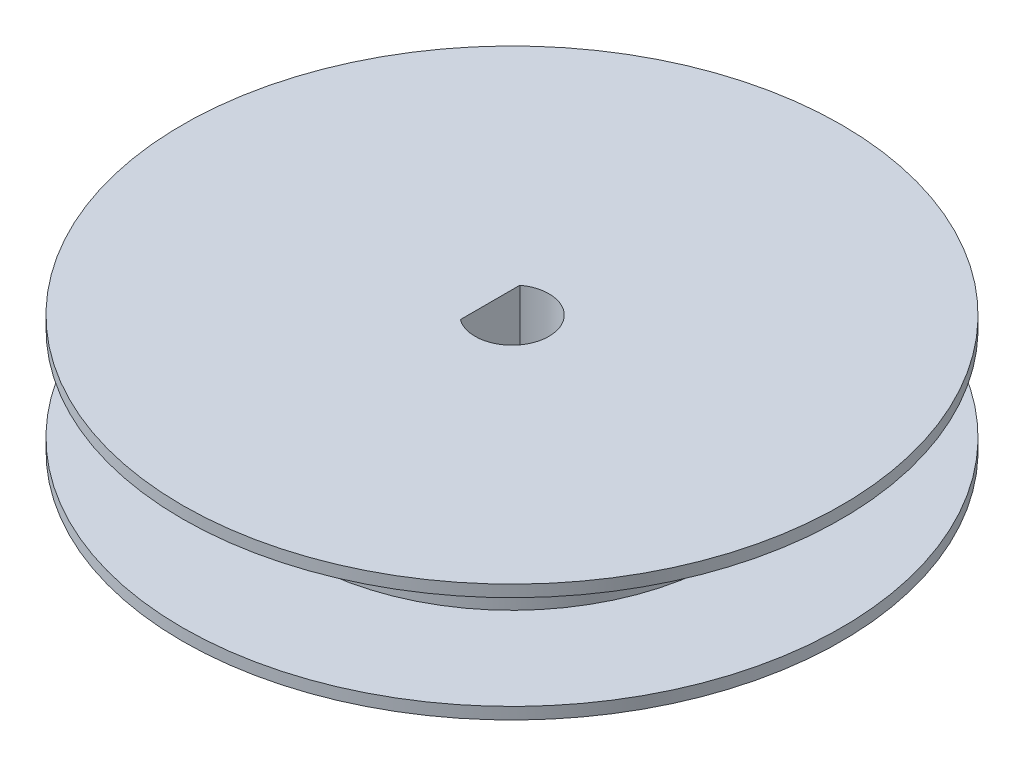
ISO-10303-21;
HEADER;
FILE_DESCRIPTION(('STEP AP214'),'2;1');
FILE_NAME('part.step','',(''),(''),'','','');
FILE_SCHEMA(('AUTOMOTIVE_DESIGN { 1 0 10303 214 1 1 1 1 }'));
ENDSEC;
DATA;
#1=APPLICATION_CONTEXT('core data for automotive mechanical design processes');
#2=APPLICATION_PROTOCOL_DEFINITION('international standard','automotive_design',2000,#1);
#3=PRODUCT_CONTEXT('',#1,'mechanical');
#4=PRODUCT('Part','Part','',(#3));
#5=PRODUCT_RELATED_PRODUCT_CATEGORY('part','',(#4));
#6=PRODUCT_DEFINITION_FORMATION('','',#4);
#7=PRODUCT_DEFINITION_CONTEXT('part definition',#1,'design');
#8=PRODUCT_DEFINITION('design','',#6,#7);
#9=PRODUCT_DEFINITION_SHAPE('','',#8);
#10=(LENGTH_UNIT() NAMED_UNIT(*) SI_UNIT(.MILLI.,.METRE.));
#11=(NAMED_UNIT(*) PLANE_ANGLE_UNIT() SI_UNIT($,.RADIAN.));
#12=(NAMED_UNIT(*) SI_UNIT($,.STERADIAN.) SOLID_ANGLE_UNIT());
#13=UNCERTAINTY_MEASURE_WITH_UNIT(LENGTH_MEASURE(1.E-05),#10,'distance_accuracy_value','');
#14=(GEOMETRIC_REPRESENTATION_CONTEXT(3) GLOBAL_UNCERTAINTY_ASSIGNED_CONTEXT((#13)) GLOBAL_UNIT_ASSIGNED_CONTEXT((#10,
#11,#12)) REPRESENTATION_CONTEXT('',''));
#15=CARTESIAN_POINT('',(0.,0.,0.));
#16=DIRECTION('',(0.,0.,1.));
#17=DIRECTION('',(1.,0.,0.));
#18=AXIS2_PLACEMENT_3D('',#15,#16,#17);
#19=CARTESIAN_POINT('',(0.,5.,0.));
#20=DIRECTION('',(0.,-1.,0.));
#21=DIRECTION('',(0.,0.,-1.));
#22=AXIS2_PLACEMENT_3D('',#19,#20,#21);
#23=CYLINDRICAL_SURFACE('',#22,9.);
#24=CARTESIAN_POINT('',(0.,4.5,0.));
#25=DIRECTION('',(0.,1.,0.));
#26=DIRECTION('',(0.,0.,1.));
#27=AXIS2_PLACEMENT_3D('',#24,#25,#26);
#28=CIRCLE('',#27,9.);
#29=CARTESIAN_POINT('',(0.,4.5,9.));
#30=VERTEX_POINT('',#29);
#31=EDGE_CURVE('E54',#30,#30,#28,.T.);
#32=ORIENTED_EDGE('',*,*,#31,.F.);
#33=EDGE_LOOP('',(#32));
#34=FACE_BOUND('',#33,.T.);
#35=CARTESIAN_POINT('',(-4.49164566759085,2.58104941694813,7.79904604402438));
#36=CARTESIAN_POINT('',(-4.49164424817047,2.59594071861455,7.79904690047306));
#37=CARTESIAN_POINT('',(-4.49047547234197,2.61084088901665,7.7997203430435));
#38=CARTESIAN_POINT('',(-4.48591116716041,2.64018290334793,7.80234628001196));
#39=CARTESIAN_POINT('',(-4.48251278517092,2.65462413524519,7.80430041296681));
#40=CARTESIAN_POINT('',(-4.4728452666167,2.68567736325836,7.80984583738454));
#41=CARTESIAN_POINT('',(-4.46611988446609,2.70209945567145,7.8136965962072));
#42=CARTESIAN_POINT('',(-4.45043475034739,2.73346180411599,7.82264100071128));
#43=CARTESIAN_POINT('',(-4.44147128386537,2.74839953838003,7.8277367123158));
#44=CARTESIAN_POINT('',(-4.41686976620896,2.78399139429734,7.84165460920603));
#45=CARTESIAN_POINT('',(-4.40015996145949,2.80367215010205,7.85105137282074));
#46=CARTESIAN_POINT('',(-4.36429115712529,2.83992071734584,7.8710476162359));
#47=CARTESIAN_POINT('',(-4.34512617018043,2.85648066575305,7.88165002885868));
#48=CARTESIAN_POINT('',(-4.28885487153041,2.899445851571,7.91248501268091));
#49=CARTESIAN_POINT('',(-4.24989304987902,2.92282806760217,7.93350259957651));
#50=CARTESIAN_POINT('',(-4.16921315314521,2.96322604645371,7.97620044182835));
#51=CARTESIAN_POINT('',(-4.12748879977326,2.98022667804934,7.99788214194875));
#52=CARTESIAN_POINT('',(-4.04103675766599,3.00979891165106,8.04191811782925));
#53=CARTESIAN_POINT('',(-3.99625575979133,3.02221253530191,8.06427186333371));
#54=CARTESIAN_POINT('',(-3.90554235538411,3.04292364958125,8.10859388646453));
#55=CARTESIAN_POINT('',(-3.85960880263176,3.05121685700186,8.13056174017322));
#56=CARTESIAN_POINT('',(-3.76684010735089,3.06443256883602,8.17395533478064));
#57=CARTESIAN_POINT('',(-3.72000258355854,3.06934438983559,8.19537915334569));
#58=CARTESIAN_POINT('',(-3.62578246690605,3.0762793750885,8.23749770966835));
#59=CARTESIAN_POINT('',(-3.57839968825551,3.07830152345385,8.25819218852811));
#60=CARTESIAN_POINT('',(-3.43791031702988,3.08059148112285,8.31811045318641));
#61=CARTESIAN_POINT('',(-3.34425364912683,3.07735197232397,8.35620185932707));
#62=CARTESIAN_POINT('',(-3.15615302001072,3.06317218142298,8.42905098946962));
#63=CARTESIAN_POINT('',(-3.06170818259119,3.05222173757036,8.46380424558062));
#64=CARTESIAN_POINT('',(-2.87295971552423,3.02346301360818,8.52971561174644));
#65=CARTESIAN_POINT('',(-2.77865670228749,3.00567824212634,8.56088557523283));
#66=CARTESIAN_POINT('',(-2.63765864609262,2.97366859595122,8.6049511030786));
#67=CARTESIAN_POINT('',(-2.59075994651196,2.96211744914117,8.61918458788604));
#68=CARTESIAN_POINT('',(-2.49723182833092,2.93702845105655,8.6467454392234));
#69=CARTESIAN_POINT('',(-2.45060235130082,2.92349104910727,8.66007300969166));
#70=CARTESIAN_POINT('',(-2.36791318339599,2.89722539015012,8.6829952673442));
#71=CARTESIAN_POINT('',(-2.33175780888706,2.88496017656611,8.69277193604383));
#72=CARTESIAN_POINT('',(-2.25991911928232,2.85857148515549,8.7117246952622));
#73=CARTESIAN_POINT('',(-2.22423635932607,2.84444600424664,8.72090012220145));
#74=CARTESIAN_POINT('',(-2.15540963657628,2.81438080447078,8.73815782643224));
#75=CARTESIAN_POINT('',(-2.12222501311193,2.79855693494186,8.74627116709942));
#76=CARTESIAN_POINT('',(-2.07377268915832,2.77212160524061,8.75783904930951));
#77=CARTESIAN_POINT('',(-2.05784466252804,2.76286128344243,8.76159420735107));
#78=CARTESIAN_POINT('',(-2.02670559003009,2.74312876500504,8.76884929074329));
#79=CARTESIAN_POINT('',(-2.01149356008554,2.73265830436466,8.77234957025398));
#80=CARTESIAN_POINT('',(-1.98516351504994,2.71223241908973,8.77834102996023));
#81=CARTESIAN_POINT('',(-1.97382793329622,2.70257919140966,8.78089543461412));
#82=CARTESIAN_POINT('',(-1.95254414749962,2.68178303717488,8.78565238515577));
#83=CARTESIAN_POINT('',(-1.94258938423108,2.67064768319939,8.78785660233295));
#84=CARTESIAN_POINT('',(-1.92973194903335,2.65266154788444,8.79068562611621));
#85=CARTESIAN_POINT('',(-1.92584019431708,2.64656317240422,8.79153867775325));
#86=CARTESIAN_POINT('',(-1.91889949189552,2.63387170270301,8.793056192357));
#87=CARTESIAN_POINT('',(-1.9158503718728,2.62727870998159,8.79372069388264));
#88=CARTESIAN_POINT('',(-1.91084680741415,2.61355045840981,8.79480933861912));
#89=CARTESIAN_POINT('',(-1.90890833113658,2.6064088864101,8.79522997667999));
#90=CARTESIAN_POINT('',(-1.90647795415078,2.59187582667675,8.7957571333182));
#91=CARTESIAN_POINT('',(-1.90598301739141,2.58448489658217,8.79586431116614));
#92=CARTESIAN_POINT('',(-1.90647731628155,2.57081496247826,8.79575716764348));
#93=CARTESIAN_POINT('',(-1.90726547794547,2.56452731750248,8.79558640332063));
#94=CARTESIAN_POINT('',(-1.90985977368662,2.55217470667787,8.79502344437804));
#95=CARTESIAN_POINT('',(-1.91166717910044,2.54611002902646,8.79463097321494));
#96=CARTESIAN_POINT('',(-1.91699431332262,2.53200521191695,8.79347159204476));
#97=CARTESIAN_POINT('',(-1.92090758551873,2.52412304528623,8.79261820035698));
#98=CARTESIAN_POINT('',(-1.92986820585446,2.50907192643088,8.7906558350962));
#99=CARTESIAN_POINT('',(-1.93491844572564,2.50190486126029,8.78954620963712));
#100=CARTESIAN_POINT('',(-1.95064835967922,2.48206542561524,8.78607308541351));
#101=CARTESIAN_POINT('',(-1.96231162434127,2.47022693035966,8.78347822318489));
#102=CARTESIAN_POINT('',(-1.98701177615187,2.44820314982875,8.77792390482094));
#103=CARTESIAN_POINT('',(-2.00005327933477,2.43802373031595,8.7749632174702));
#104=CARTESIAN_POINT('',(-2.03694269898319,2.41168403230225,8.76649525380214));
#105=CARTESIAN_POINT('',(-2.06158770532848,2.39673415923424,8.76073733852794));
#106=CARTESIAN_POINT('',(-2.11198600286351,2.36903240084626,8.7487253186128));
#107=CARTESIAN_POINT('',(-2.13774200255244,2.35628631640323,8.74246996586682));
#108=CARTESIAN_POINT('',(-2.19001512851203,2.3322985569165,8.72952242842804));
#109=CARTESIAN_POINT('',(-2.2165356541974,2.32106551534538,8.72282803628236));
#110=CARTESIAN_POINT('',(-2.26992305425342,2.29981834122289,8.70908775788765));
#111=CARTESIAN_POINT('',(-2.29678946786106,2.28980274196194,8.70204230930172));
#112=CARTESIAN_POINT('',(-2.36915207533252,2.26424582761435,8.68270241798373));
#113=CARTESIAN_POINT('',(-2.41487756671412,2.24958543530944,8.67010032761753));
#114=CARTESIAN_POINT('',(-2.50670413573591,2.22239093928594,8.64399894288647));
#115=CARTESIAN_POINT('',(-2.55280532050986,2.20985746602814,8.63049938413885));
#116=CARTESIAN_POINT('',(-2.69156211301152,2.17495078277808,8.58864527206406));
#117=CARTESIAN_POINT('',(-2.78452250158811,2.15532080170616,8.55897479128446));
#118=CARTESIAN_POINT('',(-2.97019577396397,2.12271576982825,8.49632402116192));
#119=CARTESIAN_POINT('',(-3.06290866299562,2.10972327919,8.46335268054201));
#120=CARTESIAN_POINT('',(-3.24783113792676,2.09081508858936,8.39412527925714));
#121=CARTESIAN_POINT('',(-3.34004079080632,2.08489842278853,8.35786966761671));
#122=CARTESIAN_POINT('',(-3.52278058348876,2.0814631680622,8.2824934158325));
#123=CARTESIAN_POINT('',(-3.61331794898789,2.08388635057757,8.24339449872908));
#124=CARTESIAN_POINT('',(-3.74742157015349,2.09558001281684,8.18286244553108));
#125=CARTESIAN_POINT('',(-3.79178443051725,2.10080945439667,8.16239800542036));
#126=CARTESIAN_POINT('',(-3.87976215372909,2.11444370444102,8.12094848759629));
#127=CARTESIAN_POINT('',(-3.92337741995693,2.12284674028725,8.09996370662289));
#128=CARTESIAN_POINT('',(-4.00864335219724,2.14328041180959,8.05810076372553));
#129=CARTESIAN_POINT('',(-4.05031601671984,2.15523183677721,8.03722948634152));
#130=CARTESIAN_POINT('',(-4.13216121100109,2.1837537944748,7.99545794917381));
#131=CARTESIAN_POINT('',(-4.17233231612183,2.20032859360875,7.97455768044767));
#132=CARTESIAN_POINT('',(-4.24166794513081,2.2352396343202,7.93784901747984));
#133=CARTESIAN_POINT('',(-4.27133789825283,2.25242523099705,7.92191451711759));
#134=CARTESIAN_POINT('',(-4.3280539990733,2.29143458732397,7.89106935956906));
#135=CARTESIAN_POINT('',(-4.35510852080779,2.31324277835697,7.8761554826292));
#136=CARTESIAN_POINT('',(-4.39308144175215,2.35111440038579,7.85500276195926));
#137=CARTESIAN_POINT('',(-4.40562736024163,2.36509210316689,7.84796969235094));
#138=CARTESIAN_POINT('',(-4.42893996849578,2.39487978186051,7.83483682042741));
#139=CARTESIAN_POINT('',(-4.43970794406391,2.41068841944316,7.82873634390226));
#140=CARTESIAN_POINT('',(-4.45713070527412,2.44127000479232,7.81882785343145));
#141=CARTESIAN_POINT('',(-4.46417482036432,2.45574873416197,7.8148058141529));
#142=CARTESIAN_POINT('',(-4.47609621061979,2.48583761892642,7.80798375416658));
#143=CARTESIAN_POINT('',(-4.48097822402275,2.50144521215045,7.80518106150554));
#144=CARTESIAN_POINT('',(-4.48688464239684,2.52781324903584,7.80178654396177));
#145=CARTESIAN_POINT('',(-4.48866151619574,2.53835334317456,7.80076404584509));
#146=CARTESIAN_POINT('',(-4.49104255520491,2.55961056157812,7.79939347868631));
#147=CARTESIAN_POINT('',(-4.4916466895725,2.57032769049144,7.79904542738195));
#148=CARTESIAN_POINT('',(-4.49164566759085,2.58104941694813,7.79904604402438));
#149=B_SPLINE_CURVE_WITH_KNOTS('',3,(#35,#36,#37,#38,#39,#40,#41,#42,#43,#44,#45,#46,#47,#48,
#49,#50,#51,#52,#53,#54,#55,#56,#57,#58,#59,#60,#61,#62,#63,#64,#65,#66,#67,#68,#69,#70,#71,#72,
#73,#74,#75,#76,#77,#78,#79,#80,#81,#82,#83,#84,#85,#86,#87,#88,#89,#90,#91,#92,#93,#94,#95,#96,
#97,#98,#99,#100,#101,#102,#103,#104,#105,#106,#107,#108,#109,#110,#111,#112,#113,#114,#115,
#116,#117,#118,#119,#120,#121,#122,#123,#124,#125,#126,#127,#128,#129,#130,#131,#132,#133,#134,
#135,#136,#137,#138,#139,#140,#141,#142,#143,#144,#145,#146,#147,#148),.UNSPECIFIED.,.T.,.F.,(4,
2,2,2,2,2,2,2,2,2,2,2,2,2,2,2,2,2,2,2,2,2,2,2,2,2,2,2,2,2,2,2,2,2,2,2,2,2,2,2,2,2,2,2,2,2,2,2,2,
2,2,2,2,2,2,2,4),(0.,0.0446310538585602,0.0893193219045394,0.143493464926478,0.197758124634753,
0.279717236644881,0.361880165917336,0.511232400298412,0.660936556334716,0.815399769360729,
0.970023214019308,1.12513297311367,1.28029724890503,1.58330263497744,1.88670808168471,
2.18907908767685,2.34010562414268,2.4910980483172,2.60929041082653,2.72761109622234,
2.84039419214765,2.8967711217298,2.95306815707545,2.99831669884603,3.04334234394718,
3.06514481462663,3.08694282343165,3.1090468368636,3.13110432750948,3.15002470597979,
3.16896873683371,3.1953417661522,3.22178264525658,3.27196057435382,3.32231223274262,
3.41026511432012,3.49844609548203,3.58711065912902,3.67566732288123,3.82452115350776,
3.9734190305673,4.27169745372123,4.56918807446831,4.866638083599,5.16201553147986,
5.3093349691288,5.45657224257485,5.60074249624453,5.74504623144284,5.85823118862166,
5.97104083643137,6.03107281102987,6.09106117868609,6.14066809577652,6.19016575493745,
6.2222992364279,6.25443356300757),.UNSPECIFIED.);
#150=CARTESIAN_POINT('',(-4.49164566759085,2.58104941694813,7.79904604402438));
#151=VERTEX_POINT('',#150);
#152=EDGE_CURVE('E89',#151,#151,#149,.T.);
#153=ORIENTED_EDGE('',*,*,#152,.T.);
#154=EDGE_LOOP('',(#153));
#155=FACE_BOUND('',#154,.T.);
#156=CARTESIAN_POINT('',(4.49164566759085,2.58104941694813,7.79904604402438));
#157=CARTESIAN_POINT('',(4.49164424817047,2.56615811528171,7.79904690047306));
#158=CARTESIAN_POINT('',(4.49047547234197,2.5512579448796,7.7997203430435));
#159=CARTESIAN_POINT('',(4.48591116716041,2.52191593054833,7.80234628001196));
#160=CARTESIAN_POINT('',(4.48251278517092,2.50747469865107,7.80430041296681));
#161=CARTESIAN_POINT('',(4.4728452666167,2.4764214706379,7.80984583738454));
#162=CARTESIAN_POINT('',(4.46611988446609,2.45999937822481,7.8136965962072));
#163=CARTESIAN_POINT('',(4.45043475034739,2.42863702978027,7.82264100071128));
#164=CARTESIAN_POINT('',(4.44147128386537,2.41369929551622,7.8277367123158));
#165=CARTESIAN_POINT('',(4.41686976620896,2.37810743959891,7.84165460920603));
#166=CARTESIAN_POINT('',(4.40015996145949,2.3584266837942,7.85105137282074));
#167=CARTESIAN_POINT('',(4.36429115712529,2.32217811655041,7.8710476162359));
#168=CARTESIAN_POINT('',(4.34512617018043,2.3056181681432,7.88165002885868));
#169=CARTESIAN_POINT('',(4.28885487153041,2.26265298232526,7.91248501268091));
#170=CARTESIAN_POINT('',(4.24989304987902,2.23927076629408,7.93350259957651));
#171=CARTESIAN_POINT('',(4.16921315314521,2.19887278744255,7.97620044182835));
#172=CARTESIAN_POINT('',(4.12748879977326,2.18187215584691,7.99788214194875));
#173=CARTESIAN_POINT('',(4.04103675766599,2.1522999222452,8.04191811782925));
#174=CARTESIAN_POINT('',(3.99625575979133,2.13988629859434,8.06427186333371));
#175=CARTESIAN_POINT('',(3.90554235538411,2.119175184315,8.10859388646453));
#176=CARTESIAN_POINT('',(3.85960880263176,2.11088197689439,8.13056174017322));
#177=CARTESIAN_POINT('',(3.76684010735089,2.09766626506023,8.17395533478064));
#178=CARTESIAN_POINT('',(3.72000258355854,2.09275444406066,8.19537915334569));
#179=CARTESIAN_POINT('',(3.62578246690605,2.08581945880776,8.23749770966835));
#180=CARTESIAN_POINT('',(3.57839968825551,2.0837973104424,8.25819218852811));
#181=CARTESIAN_POINT('',(3.43791031702988,2.0815073527734,8.31811045318641));
#182=CARTESIAN_POINT('',(3.34425364912683,2.08474686157228,8.35620185932707));
#183=CARTESIAN_POINT('',(3.15615302001072,2.09892665247327,8.42905098946962));
#184=CARTESIAN_POINT('',(3.06170818259119,2.1098770963259,8.46380424558062));
#185=CARTESIAN_POINT('',(2.87295971552423,2.13863582028807,8.52971561174644));
#186=CARTESIAN_POINT('',(2.77865670228749,2.15642059176992,8.56088557523283));
#187=CARTESIAN_POINT('',(2.63765864609262,2.18843023794503,8.6049511030786));
#188=CARTESIAN_POINT('',(2.59075994651196,2.19998138475508,8.61918458788604));
#189=CARTESIAN_POINT('',(2.49723182833092,2.2250703828397,8.6467454392234));
#190=CARTESIAN_POINT('',(2.45060235130082,2.23860778478899,8.66007300969166));
#191=CARTESIAN_POINT('',(2.36791318339599,2.26487344374614,8.6829952673442));
#192=CARTESIAN_POINT('',(2.33175780888706,2.27713865733014,8.69277193604383));
#193=CARTESIAN_POINT('',(2.25991911928232,2.30352734874077,8.7117246952622));
#194=CARTESIAN_POINT('',(2.22423635932607,2.31765282964962,8.72090012220145));
#195=CARTESIAN_POINT('',(2.15540963657628,2.34771802942547,8.73815782643224));
#196=CARTESIAN_POINT('',(2.12222501311193,2.36354189895439,8.74627116709942));
#197=CARTESIAN_POINT('',(2.07377268915832,2.38997722865564,8.75783904930951));
#198=CARTESIAN_POINT('',(2.05784466252804,2.39923755045383,8.76159420735107));
#199=CARTESIAN_POINT('',(2.02670559003009,2.41897006889122,8.76884929074329));
#200=CARTESIAN_POINT('',(2.01149356008554,2.42944052953159,8.77234957025398));
#201=CARTESIAN_POINT('',(1.98516351504994,2.44986641480653,8.77834102996023));
#202=CARTESIAN_POINT('',(1.97382793329622,2.45951964248659,8.78089543461412));
#203=CARTESIAN_POINT('',(1.95254414749962,2.48031579672137,8.78565238515577));
#204=CARTESIAN_POINT('',(1.94258938423108,2.49145115069686,8.78785660233295));
#205=CARTESIAN_POINT('',(1.92973194903335,2.50943728601181,8.79068562611621));
#206=CARTESIAN_POINT('',(1.92584019431708,2.51553566149203,8.79153867775325));
#207=CARTESIAN_POINT('',(1.91889949189552,2.52822713119324,8.793056192357));
#208=CARTESIAN_POINT('',(1.9158503718728,2.53482012391467,8.79372069388264));
#209=CARTESIAN_POINT('',(1.91084680741415,2.54854837548644,8.79480933861912));
#210=CARTESIAN_POINT('',(1.90890833113658,2.55568994748616,8.79522997667999));
#211=CARTESIAN_POINT('',(1.90647795415078,2.5702230072195,8.7957571333182));
#212=CARTESIAN_POINT('',(1.90598301739141,2.57761393731408,8.79586431116614));
#213=CARTESIAN_POINT('',(1.90647731628155,2.591283871418,8.79575716764348));
#214=CARTESIAN_POINT('',(1.90726547794547,2.59757151639377,8.79558640332063));
#215=CARTESIAN_POINT('',(1.90985977368662,2.60992412721839,8.79502344437804));
#216=CARTESIAN_POINT('',(1.91166717910044,2.61598880486979,8.79463097321494));
#217=CARTESIAN_POINT('',(1.91699431332262,2.6300936219793,8.79347159204476));
#218=CARTESIAN_POINT('',(1.92090758551873,2.63797578861003,8.79261820035698));
#219=CARTESIAN_POINT('',(1.92986820585446,2.65302690746537,8.7906558350962));
#220=CARTESIAN_POINT('',(1.93491844572564,2.66019397263597,8.78954620963712));
#221=CARTESIAN_POINT('',(1.95064835967922,2.68003340828102,8.78607308541351));
#222=CARTESIAN_POINT('',(1.96231162434127,2.69187190353659,8.78347822318489));
#223=CARTESIAN_POINT('',(1.98701177615187,2.7138956840675,8.77792390482094));
#224=CARTESIAN_POINT('',(2.00005327933477,2.7240751035803,8.7749632174702));
#225=CARTESIAN_POINT('',(2.03694269898319,2.750414801594,8.76649525380214));
#226=CARTESIAN_POINT('',(2.06158770532848,2.76536467466202,8.76073733852794));
#227=CARTESIAN_POINT('',(2.11198600286351,2.79306643304999,8.7487253186128));
#228=CARTESIAN_POINT('',(2.13774200255244,2.80581251749303,8.74246996586682));
#229=CARTESIAN_POINT('',(2.19001512851203,2.82980027697975,8.72952242842804));
#230=CARTESIAN_POINT('',(2.2165356541974,2.84103331855087,8.72282803628236));
#231=CARTESIAN_POINT('',(2.26992305425342,2.86228049267337,8.70908775788765));
#232=CARTESIAN_POINT('',(2.29678946786106,2.87229609193431,8.70204230930172));
#233=CARTESIAN_POINT('',(2.36915207533252,2.89785300628191,8.68270241798373));
#234=CARTESIAN_POINT('',(2.41487756671412,2.91251339858681,8.67010032761753));
#235=CARTESIAN_POINT('',(2.50670413573591,2.93970789461031,8.64399894288647));
#236=CARTESIAN_POINT('',(2.55280532050986,2.95224136786812,8.63049938413885));
#237=CARTESIAN_POINT('',(2.69156211301152,2.98714805111817,8.58864527206406));
#238=CARTESIAN_POINT('',(2.78452250158811,3.0067780321901,8.55897479128446));
#239=CARTESIAN_POINT('',(2.97019577396397,3.039383064068,8.49632402116192));
#240=CARTESIAN_POINT('',(3.06290866299562,3.05237555470625,8.46335268054201));
#241=CARTESIAN_POINT('',(3.24783113792676,3.0712837453069,8.39412527925714));
#242=CARTESIAN_POINT('',(3.34004079080632,3.07720041110773,8.35786966761671));
#243=CARTESIAN_POINT('',(3.52278058348876,3.08063566583405,8.2824934158325));
#244=CARTESIAN_POINT('',(3.61331794898789,3.07821248331868,8.24339449872908));
#245=CARTESIAN_POINT('',(3.74742157015349,3.06651882107941,8.18286244553108));
#246=CARTESIAN_POINT('',(3.79178443051725,3.06128937949959,8.16239800542036));
#247=CARTESIAN_POINT('',(3.87976215372909,3.04765512945524,8.12094848759629));
#248=CARTESIAN_POINT('',(3.92337741995693,3.039252093609,8.09996370662289));
#249=CARTESIAN_POINT('',(4.00864335219724,3.01881842208667,8.05810076372553));
#250=CARTESIAN_POINT('',(4.05031601671984,3.00686699711904,8.03722948634152));
#251=CARTESIAN_POINT('',(4.13216121100109,2.97834503942146,7.99545794917381));
#252=CARTESIAN_POINT('',(4.17233231612183,2.96177024028751,7.97455768044767));
#253=CARTESIAN_POINT('',(4.24166794513081,2.92685919957605,7.93784901747984));
#254=CARTESIAN_POINT('',(4.27133789825283,2.90967360289921,7.92191451711759));
#255=CARTESIAN_POINT('',(4.3280539990733,2.87066424657228,7.89106935956906));
#256=CARTESIAN_POINT('',(4.35510852080779,2.84885605553929,7.8761554826292));
#257=CARTESIAN_POINT('',(4.39308144175215,2.81098443351046,7.85500276195926));
#258=CARTESIAN_POINT('',(4.40562736024163,2.79700673072937,7.84796969235094));
#259=CARTESIAN_POINT('',(4.42893996849578,2.76721905203575,7.83483682042741));
#260=CARTESIAN_POINT('',(4.43970794406391,2.75141041445309,7.82873634390226));
#261=CARTESIAN_POINT('',(4.45713070527412,2.72082882910393,7.81882785343145));
#262=CARTESIAN_POINT('',(4.46417482036432,2.70635009973429,7.8148058141529));
#263=CARTESIAN_POINT('',(4.47609621061979,2.67626121496984,7.80798375416658));
#264=CARTESIAN_POINT('',(4.48097822402275,2.66065362174581,7.80518106150554));
#265=CARTESIAN_POINT('',(4.48688464239684,2.63428558486042,7.80178654396177));
#266=CARTESIAN_POINT('',(4.48866151619574,2.6237454907217,7.80076404584509));
#267=CARTESIAN_POINT('',(4.49104255520491,2.60248827231814,7.79939347868631));
#268=CARTESIAN_POINT('',(4.49164668957249,2.59177114340481,7.79904542738195));
#269=CARTESIAN_POINT('',(4.49164566759085,2.58104941694813,7.79904604402438));
#270=B_SPLINE_CURVE_WITH_KNOTS('',3,(#156,#157,#158,#159,#160,#161,#162,#163,#164,#165,#166,
#167,#168,#169,#170,#171,#172,#173,#174,#175,#176,#177,#178,#179,#180,#181,#182,#183,#184,#185,
#186,#187,#188,#189,#190,#191,#192,#193,#194,#195,#196,#197,#198,#199,#200,#201,#202,#203,#204,
#205,#206,#207,#208,#209,#210,#211,#212,#213,#214,#215,#216,#217,#218,#219,#220,#221,#222,#223,
#224,#225,#226,#227,#228,#229,#230,#231,#232,#233,#234,#235,#236,#237,#238,#239,#240,#241,#242,
#243,#244,#245,#246,#247,#248,#249,#250,#251,#252,#253,#254,#255,#256,#257,#258,#259,#260,#261,
#262,#263,#264,#265,#266,#267,#268,#269),.UNSPECIFIED.,.T.,.F.,(4,2,2,2,2,2,2,2,2,2,2,2,2,2,2,2,
2,2,2,2,2,2,2,2,2,2,2,2,2,2,2,2,2,2,2,2,2,2,2,2,2,2,2,2,2,2,2,2,2,2,2,2,2,2,2,2,4),(0.,
0.0446310538585602,0.0893193219045394,0.143493464926478,0.197758124634753,0.27971723664488,
0.361880165917336,0.511232400298412,0.660936556334716,0.815399769360729,0.970023214019308,
1.12513297311367,1.28029724890503,1.58330263497744,1.88670808168471,2.18907908767685,
2.34010562414268,2.4910980483172,2.60929041082654,2.72761109622234,2.84039419214765,
2.8967711217298,2.95306815707545,2.99831669884603,3.04334234394718,3.06514481462663,
3.08694282343165,3.1090468368636,3.13110432750948,3.15002470597979,3.16896873683371,
3.1953417661522,3.22178264525658,3.27196057435382,3.32231223274262,3.41026511432012,
3.49844609548203,3.58711065912902,3.67566732288123,3.82452115350776,3.9734190305673,
4.27169745372123,4.56918807446831,4.866638083599,5.16201553147986,5.3093349691288,
5.45657224257485,5.60074249624453,5.74504623144284,5.85823118862166,5.97104083643137,
6.03107281102987,6.09106117868609,6.14066809577652,6.19016575493745,6.2222992364279,
6.25443356300757),.UNSPECIFIED.);
#271=CARTESIAN_POINT('',(4.49164566759085,2.58104941694813,7.79904604402438));
#272=VERTEX_POINT('',#271);
#273=EDGE_CURVE('E93',#272,#272,#270,.T.);
#274=ORIENTED_EDGE('',*,*,#273,.T.);
#275=EDGE_LOOP('',(#274));
#276=FACE_BOUND('',#275,.T.);
#277=CARTESIAN_POINT('',(0.,0.5,0.));
#278=DIRECTION('',(0.,-1.,0.));
#279=DIRECTION('',(0.,0.,-1.));
#280=AXIS2_PLACEMENT_3D('',#277,#278,#279);
#281=CIRCLE('',#280,9.);
#282=CARTESIAN_POINT('',(0.,0.5,-9.));
#283=VERTEX_POINT('',#282);
#284=EDGE_CURVE('E11',#283,#283,#281,.T.);
#285=ORIENTED_EDGE('',*,*,#284,.F.);
#286=EDGE_LOOP('',(#285));
#287=FACE_BOUND('',#286,.T.);
#288=ADVANCED_FACE('F45',(#34,#155,#276,#287),#23,.T.);
#289=CARTESIAN_POINT('',(0.,5.,0.));
#290=DIRECTION('',(0.,1.,0.));
#291=DIRECTION('',(0.,0.,1.));
#292=AXIS2_PLACEMENT_3D('',#289,#290,#291);
#293=PLANE('',#292);
#294=CARTESIAN_POINT('',(0.,5.,0.));
#295=DIRECTION('',(0.,1.,0.));
#296=DIRECTION('',(0.,0.,1.));
#297=AXIS2_PLACEMENT_3D('',#294,#295,#296);
#298=CIRCLE('',#297,1.57);
#299=CARTESIAN_POINT('',(-0.93,5.,1.26491106406735));
#300=VERTEX_POINT('',#299);
#301=CARTESIAN_POINT('',(-0.93,5.,-1.26491106406735));
#302=VERTEX_POINT('',#301);
#303=EDGE_CURVE('E81',#300,#302,#298,.T.);
#304=ORIENTED_EDGE('',*,*,#303,.F.);
#305=DIRECTION('',(0.,0.,-1.));
#306=VECTOR('',#305,1.);
#307=CARTESIAN_POINT('',(-0.93,5.,0.));
#308=LINE('',#307,#306);
#309=EDGE_CURVE('E61',#300,#302,#308,.T.);
#310=ORIENTED_EDGE('',*,*,#309,.T.);
#311=EDGE_LOOP('',(#304,#310));
#312=FACE_BOUND('',#311,.T.);
#313=CARTESIAN_POINT('',(0.,5.,0.));
#314=DIRECTION('',(0.,1.,0.));
#315=DIRECTION('',(0.,0.,1.));
#316=AXIS2_PLACEMENT_3D('',#313,#314,#315);
#317=CIRCLE('',#316,14.);
#318=CARTESIAN_POINT('',(0.,5.,14.));
#319=VERTEX_POINT('',#318);
#320=EDGE_CURVE('E154',#319,#319,#317,.T.);
#321=ORIENTED_EDGE('',*,*,#320,.T.);
#322=EDGE_LOOP('',(#321));
#323=FACE_BOUND('',#322,.T.);
#324=ADVANCED_FACE('F86',(#312,#323),#293,.T.);
#325=CARTESIAN_POINT('',(0.,0.,0.));
#326=DIRECTION('',(0.,1.,0.));
#327=DIRECTION('',(0.,0.,1.));
#328=AXIS2_PLACEMENT_3D('',#325,#326,#327);
#329=PLANE('',#328);
#330=DIRECTION('',(0.,0.,-1.));
#331=VECTOR('',#330,1.);
#332=CARTESIAN_POINT('',(-0.93,0.,0.));
#333=LINE('',#332,#331);
#334=CARTESIAN_POINT('',(-0.93,0.,1.26491106406735));
#335=VERTEX_POINT('',#334);
#336=CARTESIAN_POINT('',(-0.93,0.,-1.26491106406735));
#337=VERTEX_POINT('',#336);
#338=EDGE_CURVE('E75',#335,#337,#333,.T.);
#339=ORIENTED_EDGE('',*,*,#338,.F.);
#340=CARTESIAN_POINT('',(0.,0.,0.));
#341=DIRECTION('',(0.,1.,0.));
#342=DIRECTION('',(0.,0.,1.));
#343=AXIS2_PLACEMENT_3D('',#340,#341,#342);
#344=CIRCLE('',#343,1.57);
#345=EDGE_CURVE('E96',#335,#337,#344,.T.);
#346=ORIENTED_EDGE('',*,*,#345,.T.);
#347=EDGE_LOOP('',(#339,#346));
#348=FACE_BOUND('',#347,.T.);
#349=CARTESIAN_POINT('',(0.,0.,0.));
#350=DIRECTION('',(0.,-1.,0.));
#351=DIRECTION('',(0.,0.,-1.));
#352=AXIS2_PLACEMENT_3D('',#349,#350,#351);
#353=CIRCLE('',#352,14.);
#354=CARTESIAN_POINT('',(0.,0.,-14.));
#355=VERTEX_POINT('',#354);
#356=EDGE_CURVE('E155',#355,#355,#353,.T.);
#357=ORIENTED_EDGE('',*,*,#356,.T.);
#358=EDGE_LOOP('',(#357));
#359=FACE_BOUND('',#358,.T.);
#360=ADVANCED_FACE('F124',(#348,#359),#329,.F.);
#361=CARTESIAN_POINT('',(-0.93,0.,0.));
#362=DIRECTION('',(1.,0.,0.));
#363=DIRECTION('',(0.,0.,-1.));
#364=AXIS2_PLACEMENT_3D('',#361,#362,#363);
#365=PLANE('',#364);
#366=ORIENTED_EDGE('',*,*,#309,.F.);
#367=DIRECTION('',(0.,1.,0.));
#368=VECTOR('',#367,1.);
#369=CARTESIAN_POINT('',(-0.93,0.,1.26491106406735));
#370=LINE('',#369,#368);
#371=EDGE_CURVE('E78',#335,#300,#370,.T.);
#372=ORIENTED_EDGE('',*,*,#371,.F.);
#373=ORIENTED_EDGE('',*,*,#338,.T.);
#374=DIRECTION('',(0.,1.,0.));
#375=VECTOR('',#374,1.);
#376=CARTESIAN_POINT('',(-0.93,0.,-1.26491106406735));
#377=LINE('',#376,#375);
#378=EDGE_CURVE('E68',#337,#302,#377,.T.);
#379=ORIENTED_EDGE('',*,*,#378,.T.);
#380=EDGE_LOOP('',(#366,#372,#373,#379));
#381=FACE_BOUND('',#380,.T.);
#382=ADVANCED_FACE('F73',(#381),#365,.T.);
#383=CARTESIAN_POINT('',(0.,0.,0.));
#384=DIRECTION('',(0.,1.,0.));
#385=DIRECTION('',(0.,0.,1.));
#386=AXIS2_PLACEMENT_3D('',#383,#384,#385);
#387=CYLINDRICAL_SURFACE('',#386,1.57);
#388=ORIENTED_EDGE('',*,*,#303,.T.);
#389=ORIENTED_EDGE('',*,*,#378,.F.);
#390=ORIENTED_EDGE('',*,*,#345,.F.);
#391=ORIENTED_EDGE('',*,*,#371,.T.);
#392=EDGE_LOOP('',(#388,#389,#390,#391));
#393=FACE_BOUND('',#392,.T.);
#394=ADVANCED_FACE('F82',(#393),#387,.F.);
#395=CARTESIAN_POINT('',(-50.,2.58104941694813,8.2974340600644));
#396=DIRECTION('',(1.,0.,0.));
#397=DIRECTION('',(0.,0.,-1.));
#398=AXIS2_PLACEMENT_3D('',#395,#396,#397);
#399=CYLINDRICAL_SURFACE('',#398,0.498388016040016);
#400=ORIENTED_EDGE('',*,*,#273,.F.);
#401=EDGE_LOOP('',(#400));
#402=FACE_BOUND('',#401,.T.);
#403=ORIENTED_EDGE('',*,*,#152,.F.);
#404=EDGE_LOOP('',(#403));
#405=FACE_BOUND('',#404,.T.);
#406=ADVANCED_FACE('F111',(#402,#405),#399,.F.);
#407=CARTESIAN_POINT('',(0.,4.5,0.));
#408=DIRECTION('',(0.,1.,0.));
#409=DIRECTION('',(0.,0.,1.));
#410=AXIS2_PLACEMENT_3D('',#407,#408,#409);
#411=CYLINDRICAL_SURFACE('',#410,14.);
#412=CARTESIAN_POINT('',(0.,4.5,0.));
#413=DIRECTION('',(0.,1.,0.));
#414=DIRECTION('',(0.,0.,1.));
#415=AXIS2_PLACEMENT_3D('',#412,#413,#414);
#416=CIRCLE('',#415,14.);
#417=CARTESIAN_POINT('',(0.,4.5,14.));
#418=VERTEX_POINT('',#417);
#419=EDGE_CURVE('E107',#418,#418,#416,.T.);
#420=ORIENTED_EDGE('',*,*,#419,.T.);
#421=EDGE_LOOP('',(#420));
#422=FACE_BOUND('',#421,.T.);
#423=ORIENTED_EDGE('',*,*,#320,.F.);
#424=EDGE_LOOP('',(#423));
#425=FACE_BOUND('',#424,.T.);
#426=ADVANCED_FACE('F116',(#422,#425),#411,.T.);
#427=CARTESIAN_POINT('',(0.,4.5,0.));
#428=DIRECTION('',(0.,1.,0.));
#429=DIRECTION('',(0.,0.,1.));
#430=AXIS2_PLACEMENT_3D('',#427,#428,#429);
#431=PLANE('',#430);
#432=ORIENTED_EDGE('',*,*,#31,.T.);
#433=EDGE_LOOP('',(#432));
#434=FACE_BOUND('',#433,.T.);
#435=ORIENTED_EDGE('',*,*,#419,.F.);
#436=EDGE_LOOP('',(#435));
#437=FACE_BOUND('',#436,.T.);
#438=ADVANCED_FACE('F170',(#434,#437),#431,.F.);
#439=CARTESIAN_POINT('',(0.,0.5,0.));
#440=DIRECTION('',(0.,-1.,0.));
#441=DIRECTION('',(0.,0.,-1.));
#442=AXIS2_PLACEMENT_3D('',#439,#440,#441);
#443=CYLINDRICAL_SURFACE('',#442,14.);
#444=CARTESIAN_POINT('',(0.,0.5,0.));
#445=DIRECTION('',(0.,-1.,0.));
#446=DIRECTION('',(0.,0.,-1.));
#447=AXIS2_PLACEMENT_3D('',#444,#445,#446);
#448=CIRCLE('',#447,14.);
#449=CARTESIAN_POINT('',(0.,0.5,-14.));
#450=VERTEX_POINT('',#449);
#451=EDGE_CURVE('E151',#450,#450,#448,.T.);
#452=ORIENTED_EDGE('',*,*,#451,.T.);
#453=EDGE_LOOP('',(#452));
#454=FACE_BOUND('',#453,.T.);
#455=ORIENTED_EDGE('',*,*,#356,.F.);
#456=EDGE_LOOP('',(#455));
#457=FACE_BOUND('',#456,.T.);
#458=ADVANCED_FACE('F147',(#454,#457),#443,.T.);
#459=CARTESIAN_POINT('',(0.,0.5,0.));
#460=DIRECTION('',(0.,-1.,0.));
#461=DIRECTION('',(0.,0.,-1.));
#462=AXIS2_PLACEMENT_3D('',#459,#460,#461);
#463=PLANE('',#462);
#464=ORIENTED_EDGE('',*,*,#284,.T.);
#465=EDGE_LOOP('',(#464));
#466=FACE_BOUND('',#465,.T.);
#467=ORIENTED_EDGE('',*,*,#451,.F.);
#468=EDGE_LOOP('',(#467));
#469=FACE_BOUND('',#468,.T.);
#470=ADVANCED_FACE('F144',(#466,#469),#463,.F.);
#471=CLOSED_SHELL('',(#288,#324,#360,#382,#394,#406,#426,#438,#458,#470));
#472=MANIFOLD_SOLID_BREP('B2',#471);
#473=ADVANCED_BREP_SHAPE_REPRESENTATION('',(#18,#472),#14);
#474=SHAPE_DEFINITION_REPRESENTATION(#9,#473);
ENDSEC;
END-ISO-10303-21;
